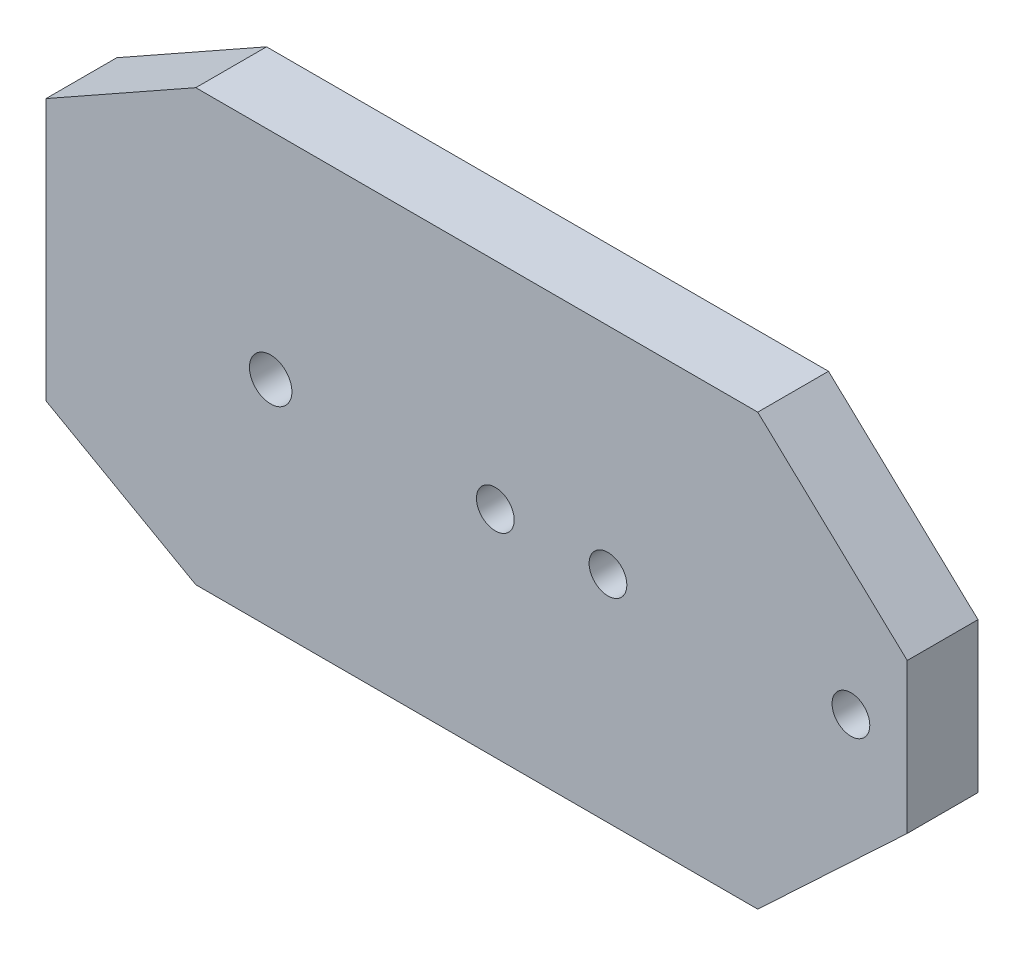
ISO-10303-21;
HEADER;
FILE_DESCRIPTION(('STEP AP214'),'2;1');
FILE_NAME('part.step','',(''),(''),'','','');
FILE_SCHEMA(('AUTOMOTIVE_DESIGN { 1 0 10303 214 1 1 1 1 }'));
ENDSEC;
DATA;
#1=APPLICATION_CONTEXT('core data for automotive mechanical design processes');
#2=APPLICATION_PROTOCOL_DEFINITION('international standard','automotive_design',2000,#1);
#3=PRODUCT_CONTEXT('',#1,'mechanical');
#4=PRODUCT('Part','Part','',(#3));
#5=PRODUCT_RELATED_PRODUCT_CATEGORY('part','',(#4));
#6=PRODUCT_DEFINITION_FORMATION('','',#4);
#7=PRODUCT_DEFINITION_CONTEXT('part definition',#1,'design');
#8=PRODUCT_DEFINITION('design','',#6,#7);
#9=PRODUCT_DEFINITION_SHAPE('','',#8);
#10=(LENGTH_UNIT() NAMED_UNIT(*) SI_UNIT(.MILLI.,.METRE.));
#11=(NAMED_UNIT(*) PLANE_ANGLE_UNIT() SI_UNIT($,.RADIAN.));
#12=(NAMED_UNIT(*) SI_UNIT($,.STERADIAN.) SOLID_ANGLE_UNIT());
#13=UNCERTAINTY_MEASURE_WITH_UNIT(LENGTH_MEASURE(1.E-05),#10,'distance_accuracy_value','');
#14=(GEOMETRIC_REPRESENTATION_CONTEXT(3) GLOBAL_UNCERTAINTY_ASSIGNED_CONTEXT((#13)) GLOBAL_UNIT_ASSIGNED_CONTEXT((#10,
#11,#12)) REPRESENTATION_CONTEXT('',''));
#15=CARTESIAN_POINT('',(0.,0.,0.));
#16=DIRECTION('',(0.,0.,1.));
#17=DIRECTION('',(1.,0.,0.));
#18=AXIS2_PLACEMENT_3D('',#15,#16,#17);
#19=CARTESIAN_POINT('',(0.,0.,6.));
#20=DIRECTION('',(0.,0.,1.));
#21=DIRECTION('',(1.,0.,0.));
#22=AXIS2_PLACEMENT_3D('',#19,#20,#21);
#23=PLANE('',#22);
#24=CARTESIAN_POINT('',(49.2,0.,6.));
#25=DIRECTION('',(0.,0.,1.));
#26=DIRECTION('',(1.,0.,0.));
#27=AXIS2_PLACEMENT_3D('',#24,#25,#26);
#28=CIRCLE('',#27,1.6);
#29=CARTESIAN_POINT('',(50.8,0.,6.));
#30=VERTEX_POINT('',#29);
#31=EDGE_CURVE('E193',#30,#30,#28,.T.);
#32=ORIENTED_EDGE('',*,*,#31,.F.);
#33=EDGE_LOOP('',(#32));
#34=FACE_BOUND('',#33,.T.);
#35=CARTESIAN_POINT('',(19.05,0.,6.));
#36=DIRECTION('',(0.,0.,1.));
#37=DIRECTION('',(1.,0.,0.));
#38=AXIS2_PLACEMENT_3D('',#35,#36,#37);
#39=CIRCLE('',#38,1.6);
#40=CARTESIAN_POINT('',(20.65,0.,6.));
#41=VERTEX_POINT('',#40);
#42=EDGE_CURVE('E139',#41,#41,#39,.T.);
#43=ORIENTED_EDGE('',*,*,#42,.F.);
#44=EDGE_LOOP('',(#43));
#45=FACE_BOUND('',#44,.T.);
#46=DIRECTION('',(0.,-1.,0.));
#47=VECTOR('',#46,1.);
#48=CARTESIAN_POINT('',(-19.05,11.1,6.));
#49=LINE('',#48,#47);
#50=CARTESIAN_POINT('',(-19.05,11.1,6.));
#51=VERTEX_POINT('',#50);
#52=CARTESIAN_POINT('',(-19.05,-11.1,6.));
#53=VERTEX_POINT('',#52);
#54=EDGE_CURVE('E151',#51,#53,#49,.T.);
#55=ORIENTED_EDGE('',*,*,#54,.T.);
#56=DIRECTION('',(0.87139223527957,-0.490586967106215,0.));
#57=VECTOR('',#56,1.);
#58=CARTESIAN_POINT('',(-19.05,-11.1,6.));
#59=LINE('',#58,#57);
#60=CARTESIAN_POINT('',(-6.35,-18.25,6.));
#61=VERTEX_POINT('',#60);
#62=EDGE_CURVE('E97',#53,#61,#59,.T.);
#63=ORIENTED_EDGE('',*,*,#62,.T.);
#64=DIRECTION('',(1.,0.,0.));
#65=VECTOR('',#64,1.);
#66=CARTESIAN_POINT('',(-6.35,-18.25,6.));
#67=LINE('',#66,#65);
#68=CARTESIAN_POINT('',(41.3,-18.25,6.));
#69=VERTEX_POINT('',#68);
#70=EDGE_CURVE('E167',#61,#69,#67,.T.);
#71=ORIENTED_EDGE('',*,*,#70,.T.);
#72=DIRECTION('',(0.729043744639039,0.684467105420478,0.));
#73=VECTOR('',#72,1.);
#74=CARTESIAN_POINT('',(41.3,-18.25,6.));
#75=LINE('',#74,#73);
#76=CARTESIAN_POINT('',(53.975,-6.35,6.));
#77=VERTEX_POINT('',#76);
#78=EDGE_CURVE('E178',#69,#77,#75,.T.);
#79=ORIENTED_EDGE('',*,*,#78,.T.);
#80=DIRECTION('',(0.,1.,0.));
#81=VECTOR('',#80,1.);
#82=CARTESIAN_POINT('',(53.975,-6.35,6.));
#83=LINE('',#82,#81);
#84=CARTESIAN_POINT('',(53.975,6.35,6.));
#85=VERTEX_POINT('',#84);
#86=EDGE_CURVE('E119',#77,#85,#83,.T.);
#87=ORIENTED_EDGE('',*,*,#86,.T.);
#88=DIRECTION('',(-0.729043744639039,0.684467105420478,0.));
#89=VECTOR('',#88,1.);
#90=CARTESIAN_POINT('',(53.975,6.35,6.));
#91=LINE('',#90,#89);
#92=CARTESIAN_POINT('',(41.3,18.25,6.));
#93=VERTEX_POINT('',#92);
#94=EDGE_CURVE('E115',#85,#93,#91,.T.);
#95=ORIENTED_EDGE('',*,*,#94,.T.);
#96=DIRECTION('',(-1.,0.,0.));
#97=VECTOR('',#96,1.);
#98=CARTESIAN_POINT('',(41.3,18.25,6.));
#99=LINE('',#98,#97);
#100=CARTESIAN_POINT('',(-6.35,18.25,6.));
#101=VERTEX_POINT('',#100);
#102=EDGE_CURVE('E117',#93,#101,#99,.T.);
#103=ORIENTED_EDGE('',*,*,#102,.T.);
#104=DIRECTION('',(-0.87139223527957,-0.490586967106215,0.));
#105=VECTOR('',#104,1.);
#106=CARTESIAN_POINT('',(-6.35,18.25,6.));
#107=LINE('',#106,#105);
#108=EDGE_CURVE('E57',#101,#51,#107,.T.);
#109=ORIENTED_EDGE('',*,*,#108,.T.);
#110=EDGE_LOOP('',(#55,#63,#71,#79,#87,#95,#103,#109));
#111=FACE_BOUND('',#110,.T.);
#112=CARTESIAN_POINT('',(28.6,0.,6.));
#113=DIRECTION('',(0.,0.,1.));
#114=DIRECTION('',(1.,0.,0.));
#115=AXIS2_PLACEMENT_3D('',#112,#113,#114);
#116=CIRCLE('',#115,1.6);
#117=CARTESIAN_POINT('',(30.2,0.,6.));
#118=VERTEX_POINT('',#117);
#119=EDGE_CURVE('E189',#118,#118,#116,.T.);
#120=ORIENTED_EDGE('',*,*,#119,.F.);
#121=EDGE_LOOP('',(#120));
#122=FACE_BOUND('',#121,.T.);
#123=CARTESIAN_POINT('',(0.,0.,6.));
#124=DIRECTION('',(0.,0.,1.));
#125=DIRECTION('',(1.,0.,0.));
#126=AXIS2_PLACEMENT_3D('',#123,#124,#125);
#127=CIRCLE('',#126,1.8);
#128=CARTESIAN_POINT('',(1.8,0.,6.));
#129=VERTEX_POINT('',#128);
#130=EDGE_CURVE('E199',#129,#129,#127,.T.);
#131=ORIENTED_EDGE('',*,*,#130,.F.);
#132=EDGE_LOOP('',(#131));
#133=FACE_BOUND('',#132,.T.);
#134=ADVANCED_FACE('F39',(#34,#45,#111,#122,#133),#23,.T.);
#135=CARTESIAN_POINT('',(0.,0.,0.));
#136=DIRECTION('',(0.,0.,1.));
#137=DIRECTION('',(1.,0.,0.));
#138=AXIS2_PLACEMENT_3D('',#135,#136,#137);
#139=PLANE('',#138);
#140=DIRECTION('',(0.,-1.,0.));
#141=VECTOR('',#140,1.);
#142=CARTESIAN_POINT('',(-19.05,11.1,0.));
#143=LINE('',#142,#141);
#144=CARTESIAN_POINT('',(-19.05,11.1,0.));
#145=VERTEX_POINT('',#144);
#146=CARTESIAN_POINT('',(-19.05,-11.1,0.));
#147=VERTEX_POINT('',#146);
#148=EDGE_CURVE('E136',#145,#147,#143,.T.);
#149=ORIENTED_EDGE('',*,*,#148,.F.);
#150=DIRECTION('',(-0.87139223527957,-0.490586967106215,0.));
#151=VECTOR('',#150,1.);
#152=CARTESIAN_POINT('',(-6.35,18.25,0.));
#153=LINE('',#152,#151);
#154=CARTESIAN_POINT('',(-6.35,18.25,0.));
#155=VERTEX_POINT('',#154);
#156=EDGE_CURVE('E93',#155,#145,#153,.T.);
#157=ORIENTED_EDGE('',*,*,#156,.F.);
#158=DIRECTION('',(-1.,0.,0.));
#159=VECTOR('',#158,1.);
#160=CARTESIAN_POINT('',(41.3,18.25,0.));
#161=LINE('',#160,#159);
#162=CARTESIAN_POINT('',(41.3,18.25,0.));
#163=VERTEX_POINT('',#162);
#164=EDGE_CURVE('E84',#163,#155,#161,.T.);
#165=ORIENTED_EDGE('',*,*,#164,.F.);
#166=DIRECTION('',(-0.729043744639039,0.684467105420478,0.));
#167=VECTOR('',#166,1.);
#168=CARTESIAN_POINT('',(53.975,6.35,0.));
#169=LINE('',#168,#167);
#170=CARTESIAN_POINT('',(53.975,6.35,0.));
#171=VERTEX_POINT('',#170);
#172=EDGE_CURVE('E127',#171,#163,#169,.T.);
#173=ORIENTED_EDGE('',*,*,#172,.F.);
#174=DIRECTION('',(0.,1.,0.));
#175=VECTOR('',#174,1.);
#176=CARTESIAN_POINT('',(53.975,-6.35,0.));
#177=LINE('',#176,#175);
#178=CARTESIAN_POINT('',(53.975,-6.35,0.));
#179=VERTEX_POINT('',#178);
#180=EDGE_CURVE('E148',#179,#171,#177,.T.);
#181=ORIENTED_EDGE('',*,*,#180,.F.);
#182=DIRECTION('',(0.729043744639039,0.684467105420478,0.));
#183=VECTOR('',#182,1.);
#184=CARTESIAN_POINT('',(41.3,-18.25,0.));
#185=LINE('',#184,#183);
#186=CARTESIAN_POINT('',(41.3,-18.25,0.));
#187=VERTEX_POINT('',#186);
#188=EDGE_CURVE('E145',#187,#179,#185,.T.);
#189=ORIENTED_EDGE('',*,*,#188,.F.);
#190=DIRECTION('',(1.,0.,0.));
#191=VECTOR('',#190,1.);
#192=CARTESIAN_POINT('',(-6.35,-18.25,0.));
#193=LINE('',#192,#191);
#194=CARTESIAN_POINT('',(-6.35,-18.25,0.));
#195=VERTEX_POINT('',#194);
#196=EDGE_CURVE('E142',#195,#187,#193,.T.);
#197=ORIENTED_EDGE('',*,*,#196,.F.);
#198=DIRECTION('',(0.87139223527957,-0.490586967106215,0.));
#199=VECTOR('',#198,1.);
#200=CARTESIAN_POINT('',(-19.05,-11.1,0.));
#201=LINE('',#200,#199);
#202=EDGE_CURVE('E138',#147,#195,#201,.T.);
#203=ORIENTED_EDGE('',*,*,#202,.F.);
#204=EDGE_LOOP('',(#149,#157,#165,#173,#181,#189,#197,#203));
#205=FACE_BOUND('',#204,.T.);
#206=CARTESIAN_POINT('',(19.05,0.,0.));
#207=DIRECTION('',(0.,0.,1.));
#208=DIRECTION('',(1.,0.,0.));
#209=AXIS2_PLACEMENT_3D('',#206,#207,#208);
#210=CIRCLE('',#209,1.6);
#211=CARTESIAN_POINT('',(20.65,0.,0.));
#212=VERTEX_POINT('',#211);
#213=EDGE_CURVE('E183',#212,#212,#210,.T.);
#214=ORIENTED_EDGE('',*,*,#213,.T.);
#215=EDGE_LOOP('',(#214));
#216=FACE_BOUND('',#215,.T.);
#217=CARTESIAN_POINT('',(28.6,0.,0.));
#218=DIRECTION('',(0.,0.,1.));
#219=DIRECTION('',(1.,0.,0.));
#220=AXIS2_PLACEMENT_3D('',#217,#218,#219);
#221=CIRCLE('',#220,1.6);
#222=CARTESIAN_POINT('',(30.2,0.,0.));
#223=VERTEX_POINT('',#222);
#224=EDGE_CURVE('E191',#223,#223,#221,.T.);
#225=ORIENTED_EDGE('',*,*,#224,.T.);
#226=EDGE_LOOP('',(#225));
#227=FACE_BOUND('',#226,.T.);
#228=CARTESIAN_POINT('',(49.2,0.,0.));
#229=DIRECTION('',(0.,0.,1.));
#230=DIRECTION('',(1.,0.,0.));
#231=AXIS2_PLACEMENT_3D('',#228,#229,#230);
#232=CIRCLE('',#231,1.6);
#233=CARTESIAN_POINT('',(50.8,0.,0.));
#234=VERTEX_POINT('',#233);
#235=EDGE_CURVE('E197',#234,#234,#232,.T.);
#236=ORIENTED_EDGE('',*,*,#235,.T.);
#237=EDGE_LOOP('',(#236));
#238=FACE_BOUND('',#237,.T.);
#239=CARTESIAN_POINT('',(0.,0.,0.));
#240=DIRECTION('',(0.,0.,1.));
#241=DIRECTION('',(1.,0.,0.));
#242=AXIS2_PLACEMENT_3D('',#239,#240,#241);
#243=CIRCLE('',#242,1.8);
#244=CARTESIAN_POINT('',(1.8,0.,0.));
#245=VERTEX_POINT('',#244);
#246=EDGE_CURVE('E201',#245,#245,#243,.T.);
#247=ORIENTED_EDGE('',*,*,#246,.T.);
#248=EDGE_LOOP('',(#247));
#249=FACE_BOUND('',#248,.T.);
#250=ADVANCED_FACE('F168',(#205,#216,#227,#238,#249),#139,.F.);
#251=CARTESIAN_POINT('',(-19.05,11.1,6.));
#252=DIRECTION('',(1.,0.,0.));
#253=DIRECTION('',(0.,0.,-1.));
#254=AXIS2_PLACEMENT_3D('',#251,#252,#253);
#255=PLANE('',#254);
#256=ORIENTED_EDGE('',*,*,#148,.T.);
#257=DIRECTION('',(0.,0.,-1.));
#258=VECTOR('',#257,1.);
#259=CARTESIAN_POINT('',(-19.05,-11.1,6.));
#260=LINE('',#259,#258);
#261=EDGE_CURVE('E11',#53,#147,#260,.T.);
#262=ORIENTED_EDGE('',*,*,#261,.F.);
#263=ORIENTED_EDGE('',*,*,#54,.F.);
#264=DIRECTION('',(0.,0.,-1.));
#265=VECTOR('',#264,1.);
#266=CARTESIAN_POINT('',(-19.05,11.1,6.));
#267=LINE('',#266,#265);
#268=EDGE_CURVE('E135',#51,#145,#267,.T.);
#269=ORIENTED_EDGE('',*,*,#268,.T.);
#270=EDGE_LOOP('',(#256,#262,#263,#269));
#271=FACE_BOUND('',#270,.T.);
#272=ADVANCED_FACE('F41',(#271),#255,.F.);
#273=CARTESIAN_POINT('',(-19.05,-11.1,6.));
#274=DIRECTION('',(0.490586967106215,0.87139223527957,0.));
#275=DIRECTION('',(-0.87139223527957,0.490586967106215,0.));
#276=AXIS2_PLACEMENT_3D('',#273,#274,#275);
#277=PLANE('',#276);
#278=ORIENTED_EDGE('',*,*,#202,.T.);
#279=DIRECTION('',(0.,0.,-1.));
#280=VECTOR('',#279,1.);
#281=CARTESIAN_POINT('',(-6.35,-18.25,6.));
#282=LINE('',#281,#280);
#283=EDGE_CURVE('E48',#61,#195,#282,.T.);
#284=ORIENTED_EDGE('',*,*,#283,.F.);
#285=ORIENTED_EDGE('',*,*,#62,.F.);
#286=ORIENTED_EDGE('',*,*,#261,.T.);
#287=EDGE_LOOP('',(#278,#284,#285,#286));
#288=FACE_BOUND('',#287,.T.);
#289=ADVANCED_FACE('F240',(#288),#277,.F.);
#290=CARTESIAN_POINT('',(-6.35,-18.25,6.));
#291=DIRECTION('',(0.,1.,0.));
#292=DIRECTION('',(0.,0.,1.));
#293=AXIS2_PLACEMENT_3D('',#290,#291,#292);
#294=PLANE('',#293);
#295=ORIENTED_EDGE('',*,*,#196,.T.);
#296=DIRECTION('',(0.,0.,-1.));
#297=VECTOR('',#296,1.);
#298=CARTESIAN_POINT('',(41.3,-18.25,6.));
#299=LINE('',#298,#297);
#300=EDGE_CURVE('E158',#69,#187,#299,.T.);
#301=ORIENTED_EDGE('',*,*,#300,.F.);
#302=ORIENTED_EDGE('',*,*,#70,.F.);
#303=ORIENTED_EDGE('',*,*,#283,.T.);
#304=EDGE_LOOP('',(#295,#301,#302,#303));
#305=FACE_BOUND('',#304,.T.);
#306=ADVANCED_FACE('F163',(#305),#294,.F.);
#307=CARTESIAN_POINT('',(41.3,-18.25,6.));
#308=DIRECTION('',(-0.684467105420478,0.729043744639039,0.));
#309=DIRECTION('',(-0.729043744639039,-0.684467105420478,0.));
#310=AXIS2_PLACEMENT_3D('',#307,#308,#309);
#311=PLANE('',#310);
#312=ORIENTED_EDGE('',*,*,#188,.T.);
#313=DIRECTION('',(0.,0.,-1.));
#314=VECTOR('',#313,1.);
#315=CARTESIAN_POINT('',(53.975,-6.35,6.));
#316=LINE('',#315,#314);
#317=EDGE_CURVE('E154',#77,#179,#316,.T.);
#318=ORIENTED_EDGE('',*,*,#317,.F.);
#319=ORIENTED_EDGE('',*,*,#78,.F.);
#320=ORIENTED_EDGE('',*,*,#300,.T.);
#321=EDGE_LOOP('',(#312,#318,#319,#320));
#322=FACE_BOUND('',#321,.T.);
#323=ADVANCED_FACE('F173',(#322),#311,.F.);
#324=CARTESIAN_POINT('',(53.975,-6.35,6.));
#325=DIRECTION('',(-1.,0.,0.));
#326=DIRECTION('',(0.,0.,1.));
#327=AXIS2_PLACEMENT_3D('',#324,#325,#326);
#328=PLANE('',#327);
#329=ORIENTED_EDGE('',*,*,#180,.T.);
#330=DIRECTION('',(0.,0.,-1.));
#331=VECTOR('',#330,1.);
#332=CARTESIAN_POINT('',(53.975,6.35,6.));
#333=LINE('',#332,#331);
#334=EDGE_CURVE('E130',#85,#171,#333,.T.);
#335=ORIENTED_EDGE('',*,*,#334,.F.);
#336=ORIENTED_EDGE('',*,*,#86,.F.);
#337=ORIENTED_EDGE('',*,*,#317,.T.);
#338=EDGE_LOOP('',(#329,#335,#336,#337));
#339=FACE_BOUND('',#338,.T.);
#340=ADVANCED_FACE('F177',(#339),#328,.F.);
#341=CARTESIAN_POINT('',(53.975,6.35,6.));
#342=DIRECTION('',(-0.684467105420478,-0.729043744639039,0.));
#343=DIRECTION('',(0.729043744639039,-0.684467105420478,0.));
#344=AXIS2_PLACEMENT_3D('',#341,#342,#343);
#345=PLANE('',#344);
#346=ORIENTED_EDGE('',*,*,#172,.T.);
#347=DIRECTION('',(0.,0.,-1.));
#348=VECTOR('',#347,1.);
#349=CARTESIAN_POINT('',(41.3,18.25,6.));
#350=LINE('',#349,#348);
#351=EDGE_CURVE('E122',#93,#163,#350,.T.);
#352=ORIENTED_EDGE('',*,*,#351,.F.);
#353=ORIENTED_EDGE('',*,*,#94,.F.);
#354=ORIENTED_EDGE('',*,*,#334,.T.);
#355=EDGE_LOOP('',(#346,#352,#353,#354));
#356=FACE_BOUND('',#355,.T.);
#357=ADVANCED_FACE('F123',(#356),#345,.F.);
#358=CARTESIAN_POINT('',(41.3,18.25,6.));
#359=DIRECTION('',(0.,-1.,0.));
#360=DIRECTION('',(0.,0.,-1.));
#361=AXIS2_PLACEMENT_3D('',#358,#359,#360);
#362=PLANE('',#361);
#363=ORIENTED_EDGE('',*,*,#164,.T.);
#364=DIRECTION('',(0.,0.,-1.));
#365=VECTOR('',#364,1.);
#366=CARTESIAN_POINT('',(-6.35,18.25,6.));
#367=LINE('',#366,#365);
#368=EDGE_CURVE('E126',#101,#155,#367,.T.);
#369=ORIENTED_EDGE('',*,*,#368,.F.);
#370=ORIENTED_EDGE('',*,*,#102,.F.);
#371=ORIENTED_EDGE('',*,*,#351,.T.);
#372=EDGE_LOOP('',(#363,#369,#370,#371));
#373=FACE_BOUND('',#372,.T.);
#374=ADVANCED_FACE('F128',(#373),#362,.F.);
#375=CARTESIAN_POINT('',(-6.35,18.25,6.));
#376=DIRECTION('',(0.490586967106215,-0.87139223527957,0.));
#377=DIRECTION('',(0.87139223527957,0.490586967106215,0.));
#378=AXIS2_PLACEMENT_3D('',#375,#376,#377);
#379=PLANE('',#378);
#380=ORIENTED_EDGE('',*,*,#156,.T.);
#381=ORIENTED_EDGE('',*,*,#268,.F.);
#382=ORIENTED_EDGE('',*,*,#108,.F.);
#383=ORIENTED_EDGE('',*,*,#368,.T.);
#384=EDGE_LOOP('',(#380,#381,#382,#383));
#385=FACE_BOUND('',#384,.T.);
#386=ADVANCED_FACE('F223',(#385),#379,.F.);
#387=CARTESIAN_POINT('',(19.05,0.,6.));
#388=DIRECTION('',(0.,0.,-1.));
#389=DIRECTION('',(-1.,0.,0.));
#390=AXIS2_PLACEMENT_3D('',#387,#388,#389);
#391=CYLINDRICAL_SURFACE('',#390,1.6);
#392=ORIENTED_EDGE('',*,*,#42,.T.);
#393=EDGE_LOOP('',(#392));
#394=FACE_BOUND('',#393,.T.);
#395=ORIENTED_EDGE('',*,*,#213,.F.);
#396=EDGE_LOOP('',(#395));
#397=FACE_BOUND('',#396,.T.);
#398=ADVANCED_FACE('F225',(#394,#397),#391,.F.);
#399=CARTESIAN_POINT('',(28.6,0.,6.));
#400=DIRECTION('',(0.,0.,-1.));
#401=DIRECTION('',(-1.,0.,0.));
#402=AXIS2_PLACEMENT_3D('',#399,#400,#401);
#403=CYLINDRICAL_SURFACE('',#402,1.6);
#404=ORIENTED_EDGE('',*,*,#119,.T.);
#405=EDGE_LOOP('',(#404));
#406=FACE_BOUND('',#405,.T.);
#407=ORIENTED_EDGE('',*,*,#224,.F.);
#408=EDGE_LOOP('',(#407));
#409=FACE_BOUND('',#408,.T.);
#410=ADVANCED_FACE('F298',(#406,#409),#403,.F.);
#411=CARTESIAN_POINT('',(49.2,0.,6.));
#412=DIRECTION('',(0.,0.,-1.));
#413=DIRECTION('',(-1.,0.,0.));
#414=AXIS2_PLACEMENT_3D('',#411,#412,#413);
#415=CYLINDRICAL_SURFACE('',#414,1.6);
#416=ORIENTED_EDGE('',*,*,#31,.T.);
#417=EDGE_LOOP('',(#416));
#418=FACE_BOUND('',#417,.T.);
#419=ORIENTED_EDGE('',*,*,#235,.F.);
#420=EDGE_LOOP('',(#419));
#421=FACE_BOUND('',#420,.T.);
#422=ADVANCED_FACE('F306',(#418,#421),#415,.F.);
#423=CARTESIAN_POINT('',(0.,0.,6.));
#424=DIRECTION('',(0.,0.,-1.));
#425=DIRECTION('',(-1.,0.,0.));
#426=AXIS2_PLACEMENT_3D('',#423,#424,#425);
#427=CYLINDRICAL_SURFACE('',#426,1.8);
#428=ORIENTED_EDGE('',*,*,#130,.T.);
#429=EDGE_LOOP('',(#428));
#430=FACE_BOUND('',#429,.T.);
#431=ORIENTED_EDGE('',*,*,#246,.F.);
#432=EDGE_LOOP('',(#431));
#433=FACE_BOUND('',#432,.T.);
#434=ADVANCED_FACE('F207',(#430,#433),#427,.F.);
#435=CLOSED_SHELL('',(#134,#250,#272,#289,#306,#323,#340,#357,#374,#386,#398,#410,#422,#434));
#436=MANIFOLD_SOLID_BREP('B2',#435);
#437=ADVANCED_BREP_SHAPE_REPRESENTATION('',(#18,#436),#14);
#438=SHAPE_DEFINITION_REPRESENTATION(#9,#437);
ENDSEC;
END-ISO-10303-21;
